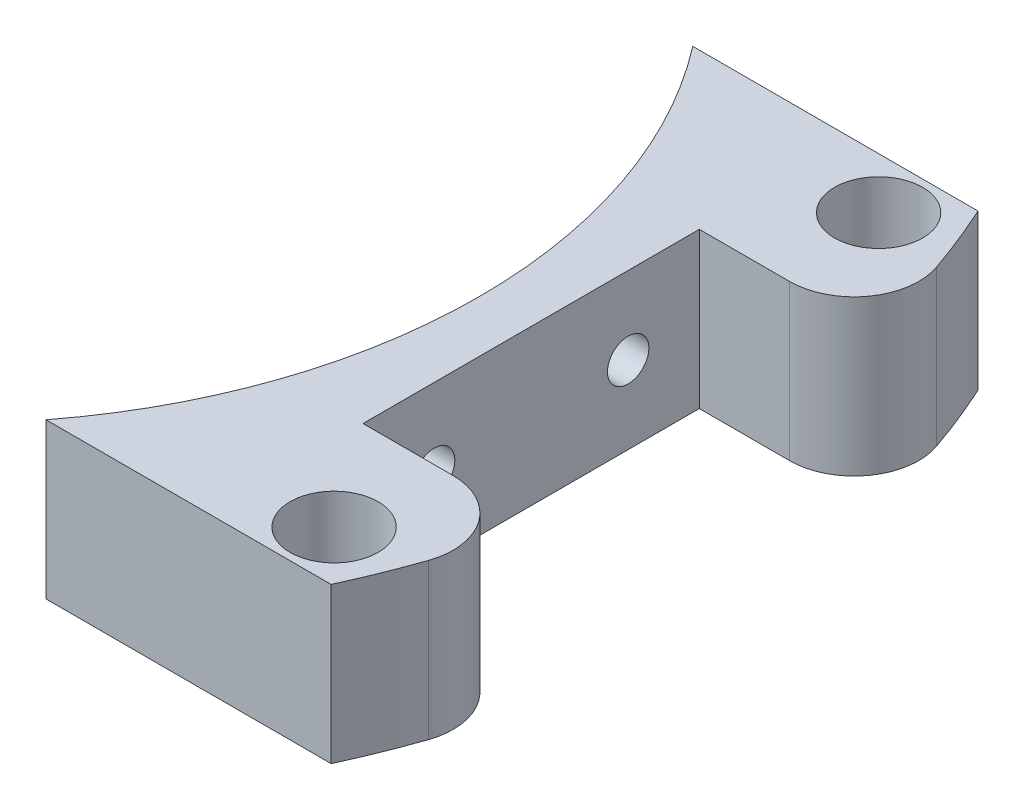
ISO-10303-21;
HEADER;
FILE_DESCRIPTION(('STEP AP214'),'2;1');
FILE_NAME('part.step','',(''),(''),'','','');
FILE_SCHEMA(('AUTOMOTIVE_DESIGN { 1 0 10303 214 1 1 1 1 }'));
ENDSEC;
DATA;
#1=APPLICATION_CONTEXT('core data for automotive mechanical design processes');
#2=APPLICATION_PROTOCOL_DEFINITION('international standard','automotive_design',2000,#1);
#3=PRODUCT_CONTEXT('',#1,'mechanical');
#4=PRODUCT('Part','Part','',(#3));
#5=PRODUCT_RELATED_PRODUCT_CATEGORY('part','',(#4));
#6=PRODUCT_DEFINITION_FORMATION('','',#4);
#7=PRODUCT_DEFINITION_CONTEXT('part definition',#1,'design');
#8=PRODUCT_DEFINITION('design','',#6,#7);
#9=PRODUCT_DEFINITION_SHAPE('','',#8);
#10=(LENGTH_UNIT() NAMED_UNIT(*) SI_UNIT(.MILLI.,.METRE.));
#11=(NAMED_UNIT(*) PLANE_ANGLE_UNIT() SI_UNIT($,.RADIAN.));
#12=(NAMED_UNIT(*) SI_UNIT($,.STERADIAN.) SOLID_ANGLE_UNIT());
#13=UNCERTAINTY_MEASURE_WITH_UNIT(LENGTH_MEASURE(1.E-05),#10,'distance_accuracy_value','');
#14=(GEOMETRIC_REPRESENTATION_CONTEXT(3) GLOBAL_UNCERTAINTY_ASSIGNED_CONTEXT((#13)) GLOBAL_UNIT_ASSIGNED_CONTEXT((#10,
#11,#12)) REPRESENTATION_CONTEXT('',''));
#15=CARTESIAN_POINT('',(0.,0.,0.));
#16=DIRECTION('',(0.,0.,1.));
#17=DIRECTION('',(1.,0.,0.));
#18=AXIS2_PLACEMENT_3D('',#15,#16,#17);
#19=CARTESIAN_POINT('',(-7.95357838980362,6.,-68.2096969177125));
#20=DIRECTION('',(1.,0.,0.));
#21=DIRECTION('',(0.,0.,-1.));
#22=AXIS2_PLACEMENT_3D('',#19,#20,#21);
#23=CYLINDRICAL_SURFACE('',#22,1.60000000000001);
#24=CARTESIAN_POINT('',(4.55026799165255,6.,-68.2096969177125));
#25=DIRECTION('',(1.,0.,0.));
#26=DIRECTION('',(0.,0.,-1.));
#27=AXIS2_PLACEMENT_3D('',#24,#25,#26);
#28=CIRCLE('',#27,1.60000000000001);
#29=CARTESIAN_POINT('',(4.55026799165255,6.,-69.8096969177125));
#30=VERTEX_POINT('',#29);
#31=EDGE_CURVE('E495',#30,#30,#28,.T.);
#32=CARTESIAN_POINT('',(2.04642161019638,6.,-68.2096969177125));
#33=DIRECTION('',(-1.,0.,0.));
#34=DIRECTION('',(0.,0.,1.));
#35=AXIS2_PLACEMENT_3D('',#32,#33,#34);
#36=CIRCLE('',#35,1.60000000000001);
#37=CARTESIAN_POINT('',(2.04642161019638,6.,-69.8096969177125));
#38=VERTEX_POINT('',#37);
#39=EDGE_CURVE('E486',#38,#38,#36,.T.);
#40=CARTESIAN_POINT('',(4.55026799165255,6.,-69.8096969177125));
#41=CARTESIAN_POINT('',(4.52418625851238,6.,-69.8096969177125));
#42=CARTESIAN_POINT('',(4.49810452537221,6.,-69.8096969177125));
#43=CARTESIAN_POINT('',(4.44594105909187,6.,-69.8096969177125));
#44=CARTESIAN_POINT('',(4.4198593259517,6.,-69.8096969177125));
#45=CARTESIAN_POINT('',(4.36769585967137,6.,-69.8096969177125));
#46=CARTESIAN_POINT('',(4.3416141265312,6.,-69.8096969177125));
#47=CARTESIAN_POINT('',(4.28945066025086,6.,-69.8096969177125));
#48=CARTESIAN_POINT('',(4.26336892711069,6.,-69.8096969177125));
#49=CARTESIAN_POINT('',(4.21120546083036,6.,-69.8096969177125));
#50=CARTESIAN_POINT('',(4.18512372769019,6.,-69.8096969177125));
#51=CARTESIAN_POINT('',(4.13296026140985,6.,-69.8096969177125));
#52=CARTESIAN_POINT('',(4.10687852826968,6.,-69.8096969177125));
#53=CARTESIAN_POINT('',(4.05471506198935,6.,-69.8096969177125));
#54=CARTESIAN_POINT('',(4.02863332884918,6.,-69.8096969177125));
#55=CARTESIAN_POINT('',(3.97646986256884,6.,-69.8096969177125));
#56=CARTESIAN_POINT('',(3.95038812942867,6.,-69.8096969177125));
#57=CARTESIAN_POINT('',(3.89822466314834,6.,-69.8096969177125));
#58=CARTESIAN_POINT('',(3.87214293000817,6.,-69.8096969177125));
#59=CARTESIAN_POINT('',(3.81997946372783,6.,-69.8096969177125));
#60=CARTESIAN_POINT('',(3.79389773058766,6.,-69.8096969177125));
#61=CARTESIAN_POINT('',(3.74173426430732,6.,-69.8096969177125));
#62=CARTESIAN_POINT('',(3.71565253116716,6.,-69.8096969177125));
#63=CARTESIAN_POINT('',(3.66348906488682,6.,-69.8096969177125));
#64=CARTESIAN_POINT('',(3.63740733174665,6.,-69.8096969177125));
#65=CARTESIAN_POINT('',(3.58524386546632,6.,-69.8096969177125));
#66=CARTESIAN_POINT('',(3.55916213232615,6.,-69.8096969177125));
#67=CARTESIAN_POINT('',(3.50699866604581,6.,-69.8096969177125));
#68=CARTESIAN_POINT('',(3.48091693290564,6.,-69.8096969177125));
#69=CARTESIAN_POINT('',(3.4287534666253,6.,-69.8096969177125));
#70=CARTESIAN_POINT('',(3.40267173348514,6.,-69.8096969177125));
#71=CARTESIAN_POINT('',(3.3505082672048,6.,-69.8096969177125));
#72=CARTESIAN_POINT('',(3.32442653406463,6.,-69.8096969177125));
#73=CARTESIAN_POINT('',(3.27226306778429,6.,-69.8096969177125));
#74=CARTESIAN_POINT('',(3.24618133464413,6.,-69.8096969177125));
#75=CARTESIAN_POINT('',(3.19401786836379,6.,-69.8096969177125));
#76=CARTESIAN_POINT('',(3.16793613522362,6.,-69.8096969177125));
#77=CARTESIAN_POINT('',(3.11577266894328,6.,-69.8096969177125));
#78=CARTESIAN_POINT('',(3.08969093580311,6.,-69.8096969177125));
#79=CARTESIAN_POINT('',(3.03752746952278,6.,-69.8096969177125));
#80=CARTESIAN_POINT('',(3.01144573638261,6.,-69.8096969177125));
#81=CARTESIAN_POINT('',(2.95928227010227,6.,-69.8096969177125));
#82=CARTESIAN_POINT('',(2.9332005369621,6.,-69.8096969177125));
#83=CARTESIAN_POINT('',(2.88103707068177,6.,-69.8096969177125));
#84=CARTESIAN_POINT('',(2.8549553375416,6.,-69.8096969177125));
#85=CARTESIAN_POINT('',(2.80279187126126,6.,-69.8096969177125));
#86=CARTESIAN_POINT('',(2.77671013812109,6.,-69.8096969177125));
#87=CARTESIAN_POINT('',(2.72454667184076,6.,-69.8096969177125));
#88=CARTESIAN_POINT('',(2.69846493870059,6.,-69.8096969177125));
#89=CARTESIAN_POINT('',(2.64630147242025,6.,-69.8096969177125));
#90=CARTESIAN_POINT('',(2.62021973928008,6.,-69.8096969177125));
#91=CARTESIAN_POINT('',(2.56805627299975,6.,-69.8096969177125));
#92=CARTESIAN_POINT('',(2.54197453985958,6.,-69.8096969177125));
#93=CARTESIAN_POINT('',(2.48981107357924,6.,-69.8096969177125));
#94=CARTESIAN_POINT('',(2.46372934043907,6.,-69.8096969177125));
#95=CARTESIAN_POINT('',(2.41156587415874,6.,-69.8096969177125));
#96=CARTESIAN_POINT('',(2.38548414101857,6.,-69.8096969177125));
#97=CARTESIAN_POINT('',(2.33332067473823,6.,-69.8096969177125));
#98=CARTESIAN_POINT('',(2.30723894159806,6.,-69.8096969177125));
#99=CARTESIAN_POINT('',(2.25507547531773,6.,-69.8096969177125));
#100=CARTESIAN_POINT('',(2.22899374217756,6.,-69.8096969177125));
#101=CARTESIAN_POINT('',(2.17683027589722,6.,-69.8096969177125));
#102=CARTESIAN_POINT('',(2.15074854275705,6.,-69.8096969177125));
#103=CARTESIAN_POINT('',(2.09858507647671,6.,-69.8096969177125));
#104=CARTESIAN_POINT('',(2.07250334333655,6.,-69.8096969177125));
#105=CARTESIAN_POINT('',(2.04642161019638,6.,-69.8096969177125));
#106=B_SPLINE_CURVE_WITH_KNOTS('',3,(#40,#41,#42,#43,#44,#45,#46,#47,#48,#49,#50,#51,#52,#53,
#54,#55,#56,#57,#58,#59,#60,#61,#62,#63,#64,#65,#66,#67,#68,#69,#70,#71,#72,#73,#74,#75,#76,#77,
#78,#79,#80,#81,#82,#83,#84,#85,#86,#87,#88,#89,#90,#91,#92,#93,#94,#95,#96,#97,#98,#99,#100,
#101,#102,#103,#104,#105),.UNSPECIFIED.,.F.,.F.,(4,2,2,2,2,2,2,2,2,2,2,2,2,2,2,2,2,2,2,2,2,2,2,
2,2,2,2,2,2,2,2,2,4),(0.,0.0782451994205055,0.156490398841011,0.234735598261517,
0.312980797682022,0.391225997102526,0.469471196523031,0.547716395943537,0.625961595364042,
0.704206794784548,0.782451994205053,0.860697193625559,0.938942393046063,1.01718759246657,
1.09543279188707,1.17367799130758,1.25192319072808,1.33016839014859,1.4084135895691,
1.4866587889896,1.56490398841011,1.64314918783061,1.72139438725112,1.79963958667162,
1.87788478609213,1.95612998551263,2.03437518493314,2.11262038435364,2.19086558377415,
2.26911078319465,2.34735598261516,2.42560118203566,2.50384638145617),.UNSPECIFIED.);
#107=EDGE_CURVE('BSEAM43',#30,#38,#106,.T.);
#108=ORIENTED_EDGE('',*,*,#31,.T.);
#109=ORIENTED_EDGE('',*,*,#39,.T.);
#110=ORIENTED_EDGE('',*,*,#107,.T.);
#111=ORIENTED_EDGE('',*,*,#107,.F.);
#112=EDGE_LOOP('',(#108,#110,#109,#111));
#113=FACE_BOUND('',#112,.T.);
#114=ADVANCED_FACE('F43',(#113),#23,.F.);
#115=CARTESIAN_POINT('',(-7.95357838980362,6.,-83.2096969177125));
#116=DIRECTION('',(1.,0.,0.));
#117=DIRECTION('',(0.,0.,-1.));
#118=AXIS2_PLACEMENT_3D('',#115,#116,#117);
#119=CYLINDRICAL_SURFACE('',#118,1.60000000000001);
#120=CARTESIAN_POINT('',(4.55026799165255,6.,-83.2096969177125));
#121=DIRECTION('',(1.,0.,0.));
#122=DIRECTION('',(0.,0.,-1.));
#123=AXIS2_PLACEMENT_3D('',#120,#121,#122);
#124=CIRCLE('',#123,1.60000000000001);
#125=CARTESIAN_POINT('',(4.55026799165255,6.,-84.8096969177125));
#126=VERTEX_POINT('',#125);
#127=EDGE_CURVE('E152',#126,#126,#124,.T.);
#128=CARTESIAN_POINT('',(2.04642161019638,6.,-83.2096969177125));
#129=DIRECTION('',(-1.,0.,0.));
#130=DIRECTION('',(0.,0.,1.));
#131=AXIS2_PLACEMENT_3D('',#128,#129,#130);
#132=CIRCLE('',#131,1.60000000000001);
#133=CARTESIAN_POINT('',(2.04642161019638,6.,-84.8096969177125));
#134=VERTEX_POINT('',#133);
#135=EDGE_CURVE('E481',#134,#134,#132,.T.);
#136=CARTESIAN_POINT('',(4.55026799165255,6.,-84.8096969177125));
#137=CARTESIAN_POINT('',(4.52418625851238,6.,-84.8096969177125));
#138=CARTESIAN_POINT('',(4.49810452537221,6.,-84.8096969177125));
#139=CARTESIAN_POINT('',(4.44594105909187,6.,-84.8096969177125));
#140=CARTESIAN_POINT('',(4.4198593259517,6.,-84.8096969177125));
#141=CARTESIAN_POINT('',(4.36769585967137,6.,-84.8096969177125));
#142=CARTESIAN_POINT('',(4.3416141265312,6.,-84.8096969177125));
#143=CARTESIAN_POINT('',(4.28945066025086,6.,-84.8096969177125));
#144=CARTESIAN_POINT('',(4.26336892711069,6.,-84.8096969177125));
#145=CARTESIAN_POINT('',(4.21120546083036,6.,-84.8096969177125));
#146=CARTESIAN_POINT('',(4.18512372769019,6.,-84.8096969177125));
#147=CARTESIAN_POINT('',(4.13296026140985,6.,-84.8096969177125));
#148=CARTESIAN_POINT('',(4.10687852826968,6.,-84.8096969177125));
#149=CARTESIAN_POINT('',(4.05471506198935,6.,-84.8096969177125));
#150=CARTESIAN_POINT('',(4.02863332884918,6.,-84.8096969177125));
#151=CARTESIAN_POINT('',(3.97646986256884,6.,-84.8096969177125));
#152=CARTESIAN_POINT('',(3.95038812942867,6.,-84.8096969177125));
#153=CARTESIAN_POINT('',(3.89822466314834,6.,-84.8096969177125));
#154=CARTESIAN_POINT('',(3.87214293000817,6.,-84.8096969177125));
#155=CARTESIAN_POINT('',(3.81997946372783,6.,-84.8096969177125));
#156=CARTESIAN_POINT('',(3.79389773058766,6.,-84.8096969177125));
#157=CARTESIAN_POINT('',(3.74173426430732,6.,-84.8096969177125));
#158=CARTESIAN_POINT('',(3.71565253116716,6.,-84.8096969177125));
#159=CARTESIAN_POINT('',(3.66348906488682,6.,-84.8096969177125));
#160=CARTESIAN_POINT('',(3.63740733174665,6.,-84.8096969177125));
#161=CARTESIAN_POINT('',(3.58524386546632,6.,-84.8096969177125));
#162=CARTESIAN_POINT('',(3.55916213232615,6.,-84.8096969177125));
#163=CARTESIAN_POINT('',(3.50699866604581,6.,-84.8096969177125));
#164=CARTESIAN_POINT('',(3.48091693290564,6.,-84.8096969177125));
#165=CARTESIAN_POINT('',(3.4287534666253,6.,-84.8096969177125));
#166=CARTESIAN_POINT('',(3.40267173348514,6.,-84.8096969177125));
#167=CARTESIAN_POINT('',(3.3505082672048,6.,-84.8096969177125));
#168=CARTESIAN_POINT('',(3.32442653406463,6.,-84.8096969177125));
#169=CARTESIAN_POINT('',(3.27226306778429,6.,-84.8096969177125));
#170=CARTESIAN_POINT('',(3.24618133464413,6.,-84.8096969177125));
#171=CARTESIAN_POINT('',(3.19401786836379,6.,-84.8096969177125));
#172=CARTESIAN_POINT('',(3.16793613522362,6.,-84.8096969177125));
#173=CARTESIAN_POINT('',(3.11577266894328,6.,-84.8096969177125));
#174=CARTESIAN_POINT('',(3.08969093580311,6.,-84.8096969177125));
#175=CARTESIAN_POINT('',(3.03752746952278,6.,-84.8096969177125));
#176=CARTESIAN_POINT('',(3.01144573638261,6.,-84.8096969177125));
#177=CARTESIAN_POINT('',(2.95928227010227,6.,-84.8096969177125));
#178=CARTESIAN_POINT('',(2.9332005369621,6.,-84.8096969177125));
#179=CARTESIAN_POINT('',(2.88103707068177,6.,-84.8096969177125));
#180=CARTESIAN_POINT('',(2.8549553375416,6.,-84.8096969177125));
#181=CARTESIAN_POINT('',(2.80279187126126,6.,-84.8096969177125));
#182=CARTESIAN_POINT('',(2.77671013812109,6.,-84.8096969177125));
#183=CARTESIAN_POINT('',(2.72454667184076,6.,-84.8096969177125));
#184=CARTESIAN_POINT('',(2.69846493870059,6.,-84.8096969177125));
#185=CARTESIAN_POINT('',(2.64630147242025,6.,-84.8096969177125));
#186=CARTESIAN_POINT('',(2.62021973928008,6.,-84.8096969177125));
#187=CARTESIAN_POINT('',(2.56805627299975,6.,-84.8096969177125));
#188=CARTESIAN_POINT('',(2.54197453985958,6.,-84.8096969177125));
#189=CARTESIAN_POINT('',(2.48981107357924,6.,-84.8096969177125));
#190=CARTESIAN_POINT('',(2.46372934043907,6.,-84.8096969177125));
#191=CARTESIAN_POINT('',(2.41156587415874,6.,-84.8096969177125));
#192=CARTESIAN_POINT('',(2.38548414101857,6.,-84.8096969177125));
#193=CARTESIAN_POINT('',(2.33332067473823,6.,-84.8096969177125));
#194=CARTESIAN_POINT('',(2.30723894159806,6.,-84.8096969177125));
#195=CARTESIAN_POINT('',(2.25507547531773,6.,-84.8096969177125));
#196=CARTESIAN_POINT('',(2.22899374217756,6.,-84.8096969177125));
#197=CARTESIAN_POINT('',(2.17683027589722,6.,-84.8096969177125));
#198=CARTESIAN_POINT('',(2.15074854275705,6.,-84.8096969177125));
#199=CARTESIAN_POINT('',(2.09858507647671,6.,-84.8096969177125));
#200=CARTESIAN_POINT('',(2.07250334333655,6.,-84.8096969177125));
#201=CARTESIAN_POINT('',(2.04642161019638,6.,-84.8096969177125));
#202=B_SPLINE_CURVE_WITH_KNOTS('',3,(#136,#137,#138,#139,#140,#141,#142,#143,#144,#145,#146,
#147,#148,#149,#150,#151,#152,#153,#154,#155,#156,#157,#158,#159,#160,#161,#162,#163,#164,#165,
#166,#167,#168,#169,#170,#171,#172,#173,#174,#175,#176,#177,#178,#179,#180,#181,#182,#183,#184,
#185,#186,#187,#188,#189,#190,#191,#192,#193,#194,#195,#196,#197,#198,#199,#200,#201),
.UNSPECIFIED.,.F.,.F.,(4,2,2,2,2,2,2,2,2,2,2,2,2,2,2,2,2,2,2,2,2,2,2,2,2,2,2,2,2,2,2,2,4),(0.,
0.0782451994205055,0.156490398841011,0.234735598261517,0.312980797682022,0.391225997102526,
0.469471196523031,0.547716395943537,0.625961595364042,0.704206794784548,0.782451994205053,
0.860697193625559,0.938942393046063,1.01718759246657,1.09543279188707,1.17367799130758,
1.25192319072808,1.33016839014859,1.4084135895691,1.4866587889896,1.56490398841011,
1.64314918783061,1.72139438725112,1.79963958667162,1.87788478609213,1.95612998551263,
2.03437518493314,2.11262038435364,2.19086558377415,2.26911078319465,2.34735598261516,
2.42560118203566,2.50384638145617),.UNSPECIFIED.);
#203=EDGE_CURVE('BSEAM237',#126,#134,#202,.T.);
#204=ORIENTED_EDGE('',*,*,#127,.T.);
#205=ORIENTED_EDGE('',*,*,#135,.T.);
#206=ORIENTED_EDGE('',*,*,#203,.T.);
#207=ORIENTED_EDGE('',*,*,#203,.F.);
#208=EDGE_LOOP('',(#204,#206,#205,#207));
#209=FACE_BOUND('',#208,.T.);
#210=ADVANCED_FACE('F237',(#209),#119,.F.);
#211=CARTESIAN_POINT('',(-40.4497320083475,12.,-75.7096969177125));
#212=DIRECTION('',(0.,-1.,0.));
#213=DIRECTION('',(0.,0.,-1.));
#214=AXIS2_PLACEMENT_3D('',#211,#212,#213);
#215=CYLINDRICAL_SURFACE('',#214,60.);
#216=CARTESIAN_POINT('',(-40.4497320083475,0.,-75.7096969177125));
#217=DIRECTION('',(0.,1.,0.));
#218=DIRECTION('',(0.,0.,1.));
#219=AXIS2_PLACEMENT_3D('',#216,#217,#218);
#220=CIRCLE('',#219,60.);
#221=CARTESIAN_POINT('',(14.0938285648311,0.,-50.7096969177125));
#222=VERTEX_POINT('',#221);
#223=CARTESIAN_POINT('',(16.2460634542836,0.,-56.0733332813489));
#224=VERTEX_POINT('',#223);
#225=EDGE_CURVE('E184',#222,#224,#220,.T.);
#226=ORIENTED_EDGE('',*,*,#225,.T.);
#227=DIRECTION('',(0.,-1.,0.));
#228=VECTOR('',#227,1.);
#229=CARTESIAN_POINT('',(16.2460634542836,12.,-56.0733332813489));
#230=LINE('',#229,#228);
#231=CARTESIAN_POINT('',(16.2460634542836,12.,-56.0733332813489));
#232=VERTEX_POINT('',#231);
#233=EDGE_CURVE('E51',#224,#232,#230,.F.);
#234=ORIENTED_EDGE('',*,*,#233,.T.);
#235=CARTESIAN_POINT('',(-40.4497320083475,12.,-75.7096969177125));
#236=DIRECTION('',(0.,1.,0.));
#237=DIRECTION('',(0.,0.,1.));
#238=AXIS2_PLACEMENT_3D('',#235,#236,#237);
#239=CIRCLE('',#238,60.);
#240=CARTESIAN_POINT('',(14.0938285648311,12.,-50.7096969177125));
#241=VERTEX_POINT('',#240);
#242=EDGE_CURVE('E165',#241,#232,#239,.T.);
#243=ORIENTED_EDGE('',*,*,#242,.F.);
#244=DIRECTION('',(0.,-1.,0.));
#245=VECTOR('',#244,1.);
#246=CARTESIAN_POINT('',(14.0938285648311,12.,-50.7096969177125));
#247=LINE('',#246,#245);
#248=EDGE_CURVE('E200',#241,#222,#247,.T.);
#249=ORIENTED_EDGE('',*,*,#248,.T.);
#250=EDGE_LOOP('',(#226,#234,#243,#249));
#251=FACE_BOUND('',#250,.T.);
#252=ADVANCED_FACE('F240',(#251),#215,.T.);
#253=CARTESIAN_POINT('',(0.,12.,-50.7096969177125));
#254=DIRECTION('',(0.,0.,-1.));
#255=DIRECTION('',(-1.,0.,0.));
#256=AXIS2_PLACEMENT_3D('',#253,#254,#255);
#257=PLANE('',#256);
#258=DIRECTION('',(1.,0.,0.));
#259=VECTOR('',#258,1.);
#260=CARTESIAN_POINT('',(0.,0.,-50.7096969177125));
#261=LINE('',#260,#259);
#262=CARTESIAN_POINT('',(-7.95357838980362,0.,-50.7096969177125));
#263=VERTEX_POINT('',#262);
#264=EDGE_CURVE('E180',#263,#222,#261,.T.);
#265=ORIENTED_EDGE('',*,*,#264,.T.);
#266=ORIENTED_EDGE('',*,*,#248,.F.);
#267=DIRECTION('',(1.,0.,0.));
#268=VECTOR('',#267,1.);
#269=CARTESIAN_POINT('',(0.,12.,-50.7096969177125));
#270=LINE('',#269,#268);
#271=CARTESIAN_POINT('',(-7.95357838980362,12.,-50.7096969177125));
#272=VERTEX_POINT('',#271);
#273=EDGE_CURVE('E160',#272,#241,#270,.T.);
#274=ORIENTED_EDGE('',*,*,#273,.F.);
#275=DIRECTION('',(0.,-1.,0.));
#276=VECTOR('',#275,1.);
#277=CARTESIAN_POINT('',(-7.95357838980362,12.,-50.7096969177125));
#278=LINE('',#277,#276);
#279=EDGE_CURVE('E177',#272,#263,#278,.T.);
#280=ORIENTED_EDGE('',*,*,#279,.T.);
#281=EDGE_LOOP('',(#265,#266,#274,#280));
#282=FACE_BOUND('',#281,.T.);
#283=ADVANCED_FACE('F279',(#282),#257,.F.);
#284=CARTESIAN_POINT('',(16.2460634542836,12.,-95.3460605540761));
#285=VERTEX_POINT('',#284);
#286=CARTESIAN_POINT('',(14.0938285648311,12.,-100.709696917713));
#287=VERTEX_POINT('',#286);
#288=EDGE_CURVE('E164',#285,#287,#239,.T.);
#289=ORIENTED_EDGE('',*,*,#288,.F.);
#290=DIRECTION('',(0.,-1.,0.));
#291=VECTOR('',#290,1.);
#292=CARTESIAN_POINT('',(16.2460634542836,12.,-95.3460605540761));
#293=LINE('',#292,#291);
#294=CARTESIAN_POINT('',(16.2460634542836,0.,-95.3460605540761));
#295=VERTEX_POINT('',#294);
#296=EDGE_CURVE('E288',#285,#295,#293,.T.);
#297=ORIENTED_EDGE('',*,*,#296,.T.);
#298=CARTESIAN_POINT('',(14.0938285648311,0.,-100.709696917713));
#299=VERTEX_POINT('',#298);
#300=EDGE_CURVE('E183',#295,#299,#220,.T.);
#301=ORIENTED_EDGE('',*,*,#300,.T.);
#302=DIRECTION('',(0.,-1.,0.));
#303=VECTOR('',#302,1.);
#304=CARTESIAN_POINT('',(14.0938285648311,12.,-100.709696917713));
#305=LINE('',#304,#303);
#306=EDGE_CURVE('E197',#287,#299,#305,.T.);
#307=ORIENTED_EDGE('',*,*,#306,.F.);
#308=EDGE_LOOP('',(#289,#297,#301,#307));
#309=FACE_BOUND('',#308,.T.);
#310=ADVANCED_FACE('F313',(#309),#215,.T.);
#311=CARTESIAN_POINT('',(0.,12.,-100.709696917713));
#312=DIRECTION('',(0.,0.,-1.));
#313=DIRECTION('',(-1.,0.,0.));
#314=AXIS2_PLACEMENT_3D('',#311,#312,#313);
#315=PLANE('',#314);
#316=DIRECTION('',(1.,0.,0.));
#317=VECTOR('',#316,1.);
#318=CARTESIAN_POINT('',(0.,0.,-100.709696917713));
#319=LINE('',#318,#317);
#320=CARTESIAN_POINT('',(-7.95357838980362,0.,-100.709696917713));
#321=VERTEX_POINT('',#320);
#322=EDGE_CURVE('E186',#321,#299,#319,.T.);
#323=ORIENTED_EDGE('',*,*,#322,.F.);
#324=DIRECTION('',(0.,-1.,0.));
#325=VECTOR('',#324,1.);
#326=CARTESIAN_POINT('',(-7.95357838980362,12.,-100.709696917713));
#327=LINE('',#326,#325);
#328=CARTESIAN_POINT('',(-7.95357838980362,12.,-100.709696917713));
#329=VERTEX_POINT('',#328);
#330=EDGE_CURVE('E195',#329,#321,#327,.T.);
#331=ORIENTED_EDGE('',*,*,#330,.F.);
#332=DIRECTION('',(1.,0.,0.));
#333=VECTOR('',#332,1.);
#334=CARTESIAN_POINT('',(0.,12.,-100.709696917713));
#335=LINE('',#334,#333);
#336=EDGE_CURVE('E168',#329,#287,#335,.T.);
#337=ORIENTED_EDGE('',*,*,#336,.T.);
#338=ORIENTED_EDGE('',*,*,#306,.T.);
#339=EDGE_LOOP('',(#323,#331,#337,#338));
#340=FACE_BOUND('',#339,.T.);
#341=ADVANCED_FACE('F275',(#340),#315,.T.);
#342=CARTESIAN_POINT('',(-40.4497320083475,12.,-75.7096969177125));
#343=DIRECTION('',(0.,-1.,0.));
#344=DIRECTION('',(0.,0.,-1.));
#345=AXIS2_PLACEMENT_3D('',#342,#343,#344);
#346=CYLINDRICAL_SURFACE('',#345,41.);
#347=CARTESIAN_POINT('',(0.354679517858884,6.,-79.7096969177125));
#348=CARTESIAN_POINT('',(0.354679923211772,6.19573040612567,-79.7097054268311));
#349=CARTESIAN_POINT('',(0.353074982542199,6.39159377568724,-79.7261709847604));
#350=CARTESIAN_POINT('',(0.34657937462129,6.77791269743719,-79.791610376265));
#351=CARTESIAN_POINT('',(0.341685000840673,6.96836189634504,-79.8406208807005));
#352=CARTESIAN_POINT('',(0.328405270445636,7.33821089703764,-79.9697093316831));
#353=CARTESIAN_POINT('',(0.320021564498353,7.51761587740801,-80.0497725871648));
#354=CARTESIAN_POINT('',(0.299477338153755,7.8603287133971,-80.2385943896633));
#355=CARTESIAN_POINT('',(0.287317720526969,8.0236404044266,-80.3473460767214));
#356=CARTESIAN_POINT('',(0.258906467776437,8.32975178565088,-80.5904443017862));
#357=CARTESIAN_POINT('',(0.242651641950646,8.47253534487044,-80.7248107771027));
#358=CARTESIAN_POINT('',(0.205818889250409,8.73348555673605,-81.0151230069587));
#359=CARTESIAN_POINT('',(0.185240786069454,8.85165120505359,-81.1710696414648));
#360=CARTESIAN_POINT('',(0.139589463976859,9.06059601934668,-81.5006137811279));
#361=CARTESIAN_POINT('',(0.114498933887219,9.15126597183206,-81.6742781061345));
#362=CARTESIAN_POINT('',(0.0600212948696441,9.30227376552961,-82.033690853151));
#363=CARTESIAN_POINT('',(0.0306340062558991,9.36261033776393,-82.2194397803455));
#364=CARTESIAN_POINT('',(-0.0323391960213345,9.4520153060868,-82.5996786834472));
#365=CARTESIAN_POINT('',(-0.0659649174260189,9.48075813518512,-82.7942385466744));
#366=CARTESIAN_POINT('',(-0.136439409792408,9.50538004263757,-83.1848447591623));
#367=CARTESIAN_POINT('',(-0.173288469900953,9.50125616971619,-83.3808912403352));
#368=CARTESIAN_POINT('',(-0.249789214873089,9.46018073218589,-83.7722641610184));
#369=CARTESIAN_POINT('',(-0.289476412987609,9.42270287025929,-83.9675284398274));
#370=CARTESIAN_POINT('',(-0.3697557724013,9.31538099702638,-84.3487643911925));
#371=CARTESIAN_POINT('',(-0.41034802665441,9.24553364649492,-84.5347351028343));
#372=CARTESIAN_POINT('',(-0.491364142438815,9.07427428710916,-84.8946477798246));
#373=CARTESIAN_POINT('',(-0.531779132666824,8.97246808877021,-85.0684044017748));
#374=CARTESIAN_POINT('',(-0.61007771995571,8.74027296987562,-85.3963064294897));
#375=CARTESIAN_POINT('',(-0.647961278371352,8.60988361309503,-85.5504515358944));
#376=CARTESIAN_POINT('',(-0.719116277065589,8.32460764301623,-85.8338991942233));
#377=CARTESIAN_POINT('',(-0.752408484695859,8.16983860750094,-85.9633147011948));
#378=CARTESIAN_POINT('',(-0.812733747526876,7.83954419022112,-86.1940970487541));
#379=CARTESIAN_POINT('',(-0.839767816270477,7.66402217649123,-86.2954684317741));
#380=CARTESIAN_POINT('',(-0.885305949781518,7.3021856244904,-86.4644017786097));
#381=CARTESIAN_POINT('',(-0.904019620590787,7.11628758868092,-86.5327987045176));
#382=CARTESIAN_POINT('',(-0.932782209567152,6.73500232541535,-86.6373525449817));
#383=CARTESIAN_POINT('',(-0.942833044573983,6.53961720729398,-86.6735165918196));
#384=CARTESIAN_POINT('',(-0.953441883237553,6.15157756913561,-86.7116714329496));
#385=CARTESIAN_POINT('',(-0.954291407755815,5.95903359222422,-86.7147116916077));
#386=CARTESIAN_POINT('',(-0.947202190863957,5.57622149685476,-86.6892374030224));
#387=CARTESIAN_POINT('',(-0.939264164419688,5.38595319451807,-86.6607254229076));
#388=CARTESIAN_POINT('',(-0.915223062400901,5.01511442392416,-86.5736092826824));
#389=CARTESIAN_POINT('',(-0.899206424474365,4.8344632222848,-86.5153236057215));
#390=CARTESIAN_POINT('',(-0.859990479038477,4.4855892520547,-86.3707448976627));
#391=CARTESIAN_POINT('',(-0.836790587853995,4.31736749479458,-86.2844495906154));
#392=CARTESIAN_POINT('',(-0.783971020487292,3.99456844201397,-86.0845825895897));
#393=CARTESIAN_POINT('',(-0.754237034552509,3.8403136885781,-85.9705207245178));
#394=CARTESIAN_POINT('',(-0.690164059239124,3.55296510411669,-85.7193683175621));
#395=CARTESIAN_POINT('',(-0.655824304830825,3.41987479660293,-85.582273948964));
#396=CARTESIAN_POINT('',(-0.5829868441672,3.17406706947198,-85.2839809675382));
#397=CARTESIAN_POINT('',(-0.54439004884987,3.06215577531294,-85.1221419800958));
#398=CARTESIAN_POINT('',(-0.465756726965528,2.86705827099465,-84.7822996179304));
#399=CARTESIAN_POINT('',(-0.425720006882688,2.78387593785496,-84.6042940655939));
#400=CARTESIAN_POINT('',(-0.344940330898147,2.64688174541276,-84.2327585243033));
#401=CARTESIAN_POINT('',(-0.304201428290655,2.59376290720614,-84.0389716208832));
#402=CARTESIAN_POINT('',(-0.224439229265524,2.52137768063248,-83.6448236045382));
#403=CARTESIAN_POINT('',(-0.185415964201244,2.50211191068138,-83.444462371584));
#404=CARTESIAN_POINT('',(-0.11033175080612,2.49821718938717,-83.0428084993085));
#405=CARTESIAN_POINT('',(-0.074271150767516,2.5135923044204,-82.8415157534081));
#406=CARTESIAN_POINT('',(-0.00605631096722571,2.57886522385815,-82.4439217322975));
#407=CARTESIAN_POINT('',(0.0260982290673591,2.62876037260656,-82.247620074323));
#408=CARTESIAN_POINT('',(0.0854648740642672,2.76093386349668,-81.8687612746825));
#409=CARTESIAN_POINT('',(0.112742837467254,2.84272409535248,-81.6860442026073));
#410=CARTESIAN_POINT('',(0.162673141575876,3.03656528168169,-81.3367481736201));
#411=CARTESIAN_POINT('',(0.185326041328885,3.14861257507265,-81.170167267555));
#412=CARTESIAN_POINT('',(0.225710676984874,3.39790468185967,-80.8606578726223));
#413=CARTESIAN_POINT('',(0.243512647380675,3.53473609449505,-80.7174054282746));
#414=CARTESIAN_POINT('',(0.274856014956067,3.83089924887446,-80.4557836621204));
#415=CARTESIAN_POINT('',(0.288396618363576,3.99023517457374,-80.3374189775604));
#416=CARTESIAN_POINT('',(0.311420774558335,4.32544108920337,-80.1300204925962));
#417=CARTESIAN_POINT('',(0.320935863792207,4.50116887323608,-80.0407600016816));
#418=CARTESIAN_POINT('',(0.336363112503396,4.8651003151523,-79.8929987716228));
#419=CARTESIAN_POINT('',(0.342279409271178,5.05328936998366,-79.834462721309));
#420=CARTESIAN_POINT('',(0.349255126696864,5.36881989841966,-79.7647377203937));
#421=CARTESIAN_POINT('',(0.351292288627219,5.49413842883607,-79.7441250461151));
#422=CARTESIAN_POINT('',(0.354004352194884,5.74628601464618,-79.7166018929898));
#423=CARTESIAN_POINT('',(0.354679255083293,5.8731150686525,-79.7096914015592));
#424=CARTESIAN_POINT('',(0.354679517858884,6.,-79.7096969177125));
#425=B_SPLINE_CURVE_WITH_KNOTS('',3,(#347,#348,#349,#350,#351,#352,#353,#354,#355,#356,#357,
#358,#359,#360,#361,#362,#363,#364,#365,#366,#367,#368,#369,#370,#371,#372,#373,#374,#375,#376,
#377,#378,#379,#380,#381,#382,#383,#384,#385,#386,#387,#388,#389,#390,#391,#392,#393,#394,#395,
#396,#397,#398,#399,#400,#401,#402,#403,#404,#405,#406,#407,#408,#409,#410,#411,#412,#413,#414,
#415,#416,#417,#418,#419,#420,#421,#422,#423,#424),.UNSPECIFIED.,.T.,.F.,(4,2,2,2,2,2,2,2,2,2,2,
2,2,2,2,2,2,2,2,2,2,2,2,2,2,2,2,2,2,2,2,2,2,2,2,2,2,2,4),(0.,0.586728798766341,1.17411983373797,
1.7612333121542,2.34820652744095,2.93563849353365,3.52309442019648,4.11285406003008,
4.70263837003395,5.29844490737565,5.89430494594947,6.49973719824874,7.10523192063531,
7.71850962981822,8.33179669925683,8.94221180190528,9.55252797492047,10.1464515622645,
10.7402436974094,11.3151658087991,11.8900411472631,12.4588920615264,13.027789209897,
13.6075682733325,14.1874437590653,14.7862336894042,15.3851043958626,15.997270050038,
16.609446886924,17.2216955889224,17.8338971953342,18.4370760094743,19.0401818720938,
19.63402546949,20.2279796177614,20.8171903850257,21.4057224896041,21.7860778630842,
22.1664328872457),.UNSPECIFIED.);
#426=CARTESIAN_POINT('',(0.354679517858884,6.,-79.7096969177125));
#427=VERTEX_POINT('',#426);
#428=EDGE_CURVE('E212',#427,#427,#425,.T.);
#429=ORIENTED_EDGE('',*,*,#428,.F.);
#430=EDGE_LOOP('',(#429));
#431=FACE_BOUND('',#430,.T.);
#432=CARTESIAN_POINT('',(-0.952896692084454,6.,-64.7096969177125));
#433=CARTESIAN_POINT('',(-0.952892877323954,6.19174493134551,-64.709706098088));
#434=CARTESIAN_POINT('',(-0.948480427385539,6.38362334396103,-64.7255161088227));
#435=CARTESIAN_POINT('',(-0.931089349392405,6.76196499823755,-64.7882548364049));
#436=CARTESIAN_POINT('',(-0.918100854716773,6.94842174407669,-64.8352193964216));
#437=CARTESIAN_POINT('',(-0.884369390380926,7.31027938827759,-64.958597536184));
#438=CARTESIAN_POINT('',(-0.863637212739306,7.48569527805766,-65.0349701358422));
#439=CARTESIAN_POINT('',(-0.815608516369856,7.82104994606107,-65.214704417535));
#440=CARTESIAN_POINT('',(-0.788312848324136,7.98099072622112,-65.3180626021656));
#441=CARTESIAN_POINT('',(-0.72803496888983,8.28428210067552,-65.550884379051));
#442=CARTESIAN_POINT('',(-0.694955585814661,8.42726469648194,-65.6808018027445));
#443=CARTESIAN_POINT('',(-0.625124534364025,8.68959179066991,-65.9617960672202));
#444=CARTESIAN_POINT('',(-0.588372187259541,8.80893190794863,-66.1128768208653));
#445=CARTESIAN_POINT('',(-0.511648246168633,9.02449705461684,-66.4372608556418));
#446=CARTESIAN_POINT('',(-0.471611425300114,9.1198656359826,-66.6111183244671));
#447=CARTESIAN_POINT('',(-0.391115048632684,9.27993609173149,-66.9723386555479));
#448=CARTESIAN_POINT('',(-0.350655447645279,9.34463465298974,-67.1597029743615));
#449=CARTESIAN_POINT('',(-0.270234909186399,9.44233442285725,-67.5459055494178));
#450=CARTESIAN_POINT('',(-0.230291756045584,9.47482237060262,-67.7448777074799));
#451=CARTESIAN_POINT('',(-0.152942111878385,9.50519246253705,-68.1459398045685));
#452=CARTESIAN_POINT('',(-0.115535559913192,9.50307543836514,-68.3480296685527));
#453=CARTESIAN_POINT('',(-0.0445371084067106,9.46411796111801,-68.7482818851168));
#454=CARTESIAN_POINT('',(-0.0109239250672953,9.42748326882382,-68.9464604115114));
#455=CARTESIAN_POINT('',(0.0520202991617965,9.32052363342582,-69.3342240646239));
#456=CARTESIAN_POINT('',(0.0813517154404146,9.25020164605497,-69.5238099436659));
#457=CARTESIAN_POINT('',(0.134907869636698,9.07907433413792,-69.8856133672601));
#458=CARTESIAN_POINT('',(0.159208077806901,8.97878476499893,-70.0580637105196));
#459=CARTESIAN_POINT('',(0.203214695518242,8.75005325226369,-70.3838187791185));
#460=CARTESIAN_POINT('',(0.222921449713401,8.62161342222945,-70.5371249404747));
#461=CARTESIAN_POINT('',(0.257650946481886,8.34211980152529,-70.8179916913402));
#462=CARTESIAN_POINT('',(0.272733090720486,8.19139319480788,-70.9458706520407));
#463=CARTESIAN_POINT('',(0.298840443406548,7.87035087161383,-71.1745963401853));
#464=CARTESIAN_POINT('',(0.309865799866561,7.70003587012054,-71.2754440538323));
#465=CARTESIAN_POINT('',(0.328116529015009,7.34582857218019,-71.4465453832875));
#466=CARTESIAN_POINT('',(0.335365543131456,7.16202917031883,-71.5169888535876));
#467=CARTESIAN_POINT('',(0.346438819625657,6.78513763733622,-71.6261347074586));
#468=CARTESIAN_POINT('',(0.350263122177214,6.59204561525065,-71.6648374633655));
#469=CARTESIAN_POINT('',(0.354649367506949,6.20242423109014,-71.7093257991549));
#470=CARTESIAN_POINT('',(0.355217180908741,6.00590169554369,-71.7151706131925));
#471=CARTESIAN_POINT('',(0.353132358885641,5.61466164184662,-71.6939319299737));
#472=CARTESIAN_POINT('',(0.350479736198977,5.41994411655946,-71.6668485629626));
#473=CARTESIAN_POINT('',(0.341836400945137,5.03789125643067,-71.58055583672));
#474=CARTESIAN_POINT('',(0.335846517642286,4.85055410004393,-71.5213544584777));
#475=CARTESIAN_POINT('',(0.320291979492544,4.48852372933732,-71.3725658617117));
#476=CARTESIAN_POINT('',(0.310727345117181,4.31383044261664,-71.2829788171978));
#477=CARTESIAN_POINT('',(0.287716426958221,3.98194650226781,-71.076005203195));
#478=CARTESIAN_POINT('',(0.274268379908773,3.82476384437882,-70.9586060099424));
#479=CARTESIAN_POINT('',(0.243201611323086,3.53239678474584,-70.6994940184517));
#480=CARTESIAN_POINT('',(0.2255828944598,3.39721235835462,-70.5577812474553));
#481=CARTESIAN_POINT('',(0.185929397235888,3.15224090942814,-70.2538262171192));
#482=CARTESIAN_POINT('',(0.16388350684121,3.04251931006429,-70.0915326955534));
#483=CARTESIAN_POINT('',(0.115386964042315,2.85182987063938,-69.7514598419901));
#484=CARTESIAN_POINT('',(0.0889361952305768,2.77086279064989,-69.5736801007982));
#485=CARTESIAN_POINT('',(0.03163311213544,2.63918069376274,-69.2063228567158));
#486=CARTESIAN_POINT('',(0.000748025091680226,2.5887069638407,-69.0166640343704));
#487=CARTESIAN_POINT('',(-0.0647441381410586,2.52011239035838,-68.6322131513435));
#488=CARTESIAN_POINT('',(-0.0993515086013054,2.50199410670751,-68.4374206857337));
#489=CARTESIAN_POINT('',(-0.171993895701008,2.49829107878431,-68.0452232645191));
#490=CARTESIAN_POINT('',(-0.210071612426338,2.51318564267347,-67.8478217310124));
#491=CARTESIAN_POINT('',(-0.288058197401686,2.57584773063519,-67.4586748552473));
#492=CARTESIAN_POINT('',(-0.327967260025727,2.62361875169162,-67.2669301169504));
#493=CARTESIAN_POINT('',(-0.408823475111472,2.75162438520012,-66.8913565247051));
#494=CARTESIAN_POINT('',(-0.44977712685636,2.83235116512946,-66.7076966389257));
#495=CARTESIAN_POINT('',(-0.530410650438807,3.02408480022466,-66.3566083821262));
#496=CARTESIAN_POINT('',(-0.570090490055914,3.13509242065605,-66.1891804214685));
#497=CARTESIAN_POINT('',(-0.646425819539753,3.38482404110941,-65.8749080668033));
#498=CARTESIAN_POINT('',(-0.683073332311403,3.5236180548439,-65.7281172959974));
#499=CARTESIAN_POINT('',(-0.751321649673205,3.8251243180143,-65.4600431780014));
#500=CARTESIAN_POINT('',(-0.782921752231462,3.98783988860712,-65.3387633783275));
#501=CARTESIAN_POINT('',(-0.838681296667506,4.32923715893395,-65.1278081313769));
#502=CARTESIAN_POINT('',(-0.862974867979302,4.50754185602583,-65.0375579593846));
#503=CARTESIAN_POINT('',(-0.903435003696634,4.87755450427769,-64.8885871342378));
#504=CARTESIAN_POINT('',(-0.919613254265845,5.0692427268943,-64.8298211351265));
#505=CARTESIAN_POINT('',(-0.938389708579252,5.38527186170718,-64.7618889260164));
#506=CARTESIAN_POINT('',(-0.943815513211363,5.50731392026006,-64.7423478110552));
#507=CARTESIAN_POINT('',(-0.951070190871786,5.75288552645361,-64.7162490052427));
#508=CARTESIAN_POINT('',(-0.952899150804107,5.87641503808312,-64.7096910007042));
#509=CARTESIAN_POINT('',(-0.952896692084454,6.,-64.7096969177125));
#510=B_SPLINE_CURVE_WITH_KNOTS('',3,(#432,#433,#434,#435,#436,#437,#438,#439,#440,#441,#442,
#443,#444,#445,#446,#447,#448,#449,#450,#451,#452,#453,#454,#455,#456,#457,#458,#459,#460,#461,
#462,#463,#464,#465,#466,#467,#468,#469,#470,#471,#472,#473,#474,#475,#476,#477,#478,#479,#480,
#481,#482,#483,#484,#485,#486,#487,#488,#489,#490,#491,#492,#493,#494,#495,#496,#497,#498,#499,
#500,#501,#502,#503,#504,#505,#506,#507,#508,#509),.UNSPECIFIED.,.T.,.F.,(4,2,2,2,2,2,2,2,2,2,2,
2,2,2,2,2,2,2,2,2,2,2,2,2,2,2,2,2,2,2,2,2,2,2,2,2,2,2,4),(0.,0.574774050912045,1.15021052633127,
1.72484801639279,2.29941106883505,2.8847650647619,3.4702274292849,4.07432097117048,
4.67847975531925,5.29211782950747,5.90574115654811,6.51572964575874,7.12566462420397,
7.72565406793036,8.32559847901049,8.91747844561788,9.50933681524845,10.0974439829545,
10.6855442517409,11.2725839909041,11.8596214080769,12.4465130193723,13.0334012697666,
13.6205564172495,14.2077109068678,14.7963577055182,15.3850200627799,15.9782813614116,
16.5715895958171,17.1735683203591,17.7756110857222,18.386994429333,18.9983932254192,
19.6113524119304,20.224396779331,20.8253827619249,21.4255008147552,21.7959676897243,
22.1664256136669),.UNSPECIFIED.);
#511=CARTESIAN_POINT('',(-0.952896692084454,6.,-64.7096969177125));
#512=VERTEX_POINT('',#511);
#513=EDGE_CURVE('E204',#512,#512,#510,.T.);
#514=ORIENTED_EDGE('',*,*,#513,.F.);
#515=EDGE_LOOP('',(#514));
#516=FACE_BOUND('',#515,.T.);
#517=CARTESIAN_POINT('',(-40.4497320083475,0.,-75.7096969177125));
#518=DIRECTION('',(0.,1.,0.));
#519=DIRECTION('',(0.,0.,1.));
#520=AXIS2_PLACEMENT_3D('',#517,#518,#519);
#521=CIRCLE('',#520,41.);
#522=EDGE_CURVE('E189',#263,#321,#521,.T.);
#523=ORIENTED_EDGE('',*,*,#522,.F.);
#524=ORIENTED_EDGE('',*,*,#279,.F.);
#525=CARTESIAN_POINT('',(-40.4497320083475,12.,-75.7096969177125));
#526=DIRECTION('',(0.,1.,0.));
#527=DIRECTION('',(0.,0.,1.));
#528=AXIS2_PLACEMENT_3D('',#525,#526,#527);
#529=CIRCLE('',#528,41.);
#530=EDGE_CURVE('E171',#272,#329,#529,.T.);
#531=ORIENTED_EDGE('',*,*,#530,.T.);
#532=ORIENTED_EDGE('',*,*,#330,.T.);
#533=EDGE_LOOP('',(#523,#524,#531,#532));
#534=FACE_BOUND('',#533,.T.);
#535=ADVANCED_FACE('F219',(#431,#516,#534),#346,.F.);
#536=CARTESIAN_POINT('',(10.3636422797733,12.,-54.6621081376325));
#537=DIRECTION('',(0.,-1.,0.));
#538=DIRECTION('',(0.,0.,-1.));
#539=AXIS2_PLACEMENT_3D('',#536,#537,#538);
#540=CYLINDRICAL_SURFACE('',#539,3.4);
#541=CARTESIAN_POINT('',(10.3636422797733,12.,-54.6621081376325));
#542=DIRECTION('',(0.,1.,0.));
#543=DIRECTION('',(0.,0.,1.));
#544=AXIS2_PLACEMENT_3D('',#541,#542,#543);
#545=CIRCLE('',#544,3.4);
#546=CARTESIAN_POINT('',(10.3636422797733,12.,-51.2621081376325));
#547=VERTEX_POINT('',#546);
#548=EDGE_CURVE('E157',#547,#547,#545,.T.);
#549=ORIENTED_EDGE('',*,*,#548,.T.);
#550=EDGE_LOOP('',(#549));
#551=FACE_BOUND('',#550,.T.);
#552=CARTESIAN_POINT('',(10.3636422797733,0.,-54.6621081376325));
#553=DIRECTION('',(0.,1.,0.));
#554=DIRECTION('',(0.,0.,1.));
#555=AXIS2_PLACEMENT_3D('',#552,#553,#554);
#556=CIRCLE('',#555,3.4);
#557=CARTESIAN_POINT('',(10.3636422797733,0.,-51.2621081376325));
#558=VERTEX_POINT('',#557);
#559=EDGE_CURVE('E155',#558,#558,#556,.T.);
#560=ORIENTED_EDGE('',*,*,#559,.F.);
#561=EDGE_LOOP('',(#560));
#562=FACE_BOUND('',#561,.T.);
#563=ADVANCED_FACE('F261',(#551,#562),#540,.F.);
#564=CARTESIAN_POINT('',(10.3636422797733,12.,-96.7572856977924));
#565=DIRECTION('',(0.,-1.,0.));
#566=DIRECTION('',(0.,0.,-1.));
#567=AXIS2_PLACEMENT_3D('',#564,#565,#566);
#568=CYLINDRICAL_SURFACE('',#567,3.4);
#569=CARTESIAN_POINT('',(10.3636422797733,12.,-96.7572856977924));
#570=DIRECTION('',(0.,1.,0.));
#571=DIRECTION('',(0.,0.,1.));
#572=AXIS2_PLACEMENT_3D('',#569,#570,#571);
#573=CIRCLE('',#572,3.4);
#574=CARTESIAN_POINT('',(10.3636422797733,12.,-93.3572856977924));
#575=VERTEX_POINT('',#574);
#576=EDGE_CURVE('E174',#575,#575,#573,.T.);
#577=ORIENTED_EDGE('',*,*,#576,.T.);
#578=EDGE_LOOP('',(#577));
#579=FACE_BOUND('',#578,.T.);
#580=CARTESIAN_POINT('',(10.3636422797733,0.,-96.7572856977924));
#581=DIRECTION('',(0.,1.,0.));
#582=DIRECTION('',(0.,0.,1.));
#583=AXIS2_PLACEMENT_3D('',#580,#581,#582);
#584=CIRCLE('',#583,3.4);
#585=CARTESIAN_POINT('',(10.3636422797733,0.,-93.3572856977924));
#586=VERTEX_POINT('',#585);
#587=EDGE_CURVE('E161',#586,#586,#584,.T.);
#588=ORIENTED_EDGE('',*,*,#587,.F.);
#589=EDGE_LOOP('',(#588));
#590=FACE_BOUND('',#589,.T.);
#591=ADVANCED_FACE('F256',(#579,#590),#568,.F.);
#592=CARTESIAN_POINT('',(0.,12.,0.));
#593=DIRECTION('',(0.,1.,0.));
#594=DIRECTION('',(0.,0.,1.));
#595=AXIS2_PLACEMENT_3D('',#592,#593,#594);
#596=PLANE('',#595);
#597=DIRECTION('',(-1.,0.,0.));
#598=VECTOR('',#597,1.);
#599=CARTESIAN_POINT('',(0.,12.,-88.7096969177125));
#600=LINE('',#599,#598);
#601=CARTESIAN_POINT('',(11.5214138323977,12.,-88.7096969177125));
#602=VERTEX_POINT('',#601);
#603=CARTESIAN_POINT('',(4.55026799165254,12.,-88.7096969177125));
#604=VERTEX_POINT('',#603);
#605=EDGE_CURVE('E136',#602,#604,#600,.T.);
#606=ORIENTED_EDGE('',*,*,#605,.F.);
#607=CARTESIAN_POINT('',(11.5214138323977,12.,-93.7096969177125));
#608=DIRECTION('',(0.,1.,0.));
#609=DIRECTION('',(0.,0.,1.));
#610=AXIS2_PLACEMENT_3D('',#607,#608,#609);
#611=CIRCLE('',#610,5.);
#612=EDGE_CURVE('E294',#602,#285,#611,.T.);
#613=ORIENTED_EDGE('',*,*,#612,.T.);
#614=ORIENTED_EDGE('',*,*,#288,.T.);
#615=ORIENTED_EDGE('',*,*,#336,.F.);
#616=ORIENTED_EDGE('',*,*,#530,.F.);
#617=ORIENTED_EDGE('',*,*,#273,.T.);
#618=ORIENTED_EDGE('',*,*,#242,.T.);
#619=CARTESIAN_POINT('',(11.5214138323977,12.,-57.7096969177125));
#620=DIRECTION('',(0.,1.,0.));
#621=DIRECTION('',(0.,0.,1.));
#622=AXIS2_PLACEMENT_3D('',#619,#620,#621);
#623=CIRCLE('',#622,5.);
#624=CARTESIAN_POINT('',(11.5214138323977,12.,-62.7096969177125));
#625=VERTEX_POINT('',#624);
#626=EDGE_CURVE('E296',#232,#625,#623,.T.);
#627=ORIENTED_EDGE('',*,*,#626,.T.);
#628=DIRECTION('',(-1.,0.,0.));
#629=VECTOR('',#628,1.);
#630=CARTESIAN_POINT('',(0.,12.,-62.7096969177125));
#631=LINE('',#630,#629);
#632=CARTESIAN_POINT('',(4.55026799165255,12.,-62.7096969177125));
#633=VERTEX_POINT('',#632);
#634=EDGE_CURVE('E130',#625,#633,#631,.T.);
#635=ORIENTED_EDGE('',*,*,#634,.T.);
#636=DIRECTION('',(0.,0.,1.));
#637=VECTOR('',#636,1.);
#638=CARTESIAN_POINT('',(4.55026799165255,12.,0.));
#639=LINE('',#638,#637);
#640=EDGE_CURVE('E151',#604,#633,#639,.T.);
#641=ORIENTED_EDGE('',*,*,#640,.F.);
#642=EDGE_LOOP('',(#606,#613,#614,#615,#616,#617,#618,#627,#635,#641));
#643=FACE_BOUND('',#642,.T.);
#644=ORIENTED_EDGE('',*,*,#548,.F.);
#645=EDGE_LOOP('',(#644));
#646=FACE_BOUND('',#645,.T.);
#647=ORIENTED_EDGE('',*,*,#576,.F.);
#648=EDGE_LOOP('',(#647));
#649=FACE_BOUND('',#648,.T.);
#650=ADVANCED_FACE('F253',(#643,#646,#649),#596,.T.);
#651=CARTESIAN_POINT('',(0.,0.,0.));
#652=DIRECTION('',(0.,1.,0.));
#653=DIRECTION('',(0.,0.,1.));
#654=AXIS2_PLACEMENT_3D('',#651,#652,#653);
#655=PLANE('',#654);
#656=ORIENTED_EDGE('',*,*,#559,.T.);
#657=EDGE_LOOP('',(#656));
#658=FACE_BOUND('',#657,.T.);
#659=ORIENTED_EDGE('',*,*,#300,.F.);
#660=CARTESIAN_POINT('',(11.5214138323977,0.,-93.7096969177125));
#661=DIRECTION('',(0.,1.,0.));
#662=DIRECTION('',(0.,0.,1.));
#663=AXIS2_PLACEMENT_3D('',#660,#661,#662);
#664=CIRCLE('',#663,5.);
#665=CARTESIAN_POINT('',(11.5214138323977,0.,-88.7096969177125));
#666=VERTEX_POINT('',#665);
#667=EDGE_CURVE('E126',#295,#666,#664,.F.);
#668=ORIENTED_EDGE('',*,*,#667,.T.);
#669=DIRECTION('',(-1.,0.,0.));
#670=VECTOR('',#669,1.);
#671=CARTESIAN_POINT('',(0.,0.,-88.7096969177125));
#672=LINE('',#671,#670);
#673=CARTESIAN_POINT('',(4.55026799165254,0.,-88.7096969177125));
#674=VERTEX_POINT('',#673);
#675=EDGE_CURVE('E118',#666,#674,#672,.T.);
#676=ORIENTED_EDGE('',*,*,#675,.T.);
#677=DIRECTION('',(0.,0.,1.));
#678=VECTOR('',#677,1.);
#679=CARTESIAN_POINT('',(4.55026799165255,0.,0.));
#680=LINE('',#679,#678);
#681=CARTESIAN_POINT('',(4.55026799165255,0.,-62.7096969177125));
#682=VERTEX_POINT('',#681);
#683=EDGE_CURVE('E124',#674,#682,#680,.T.);
#684=ORIENTED_EDGE('',*,*,#683,.T.);
#685=DIRECTION('',(-1.,0.,0.));
#686=VECTOR('',#685,1.);
#687=CARTESIAN_POINT('',(0.,0.,-62.7096969177125));
#688=LINE('',#687,#686);
#689=CARTESIAN_POINT('',(11.5214138323977,0.,-62.7096969177125));
#690=VERTEX_POINT('',#689);
#691=EDGE_CURVE('E141',#690,#682,#688,.T.);
#692=ORIENTED_EDGE('',*,*,#691,.F.);
#693=CARTESIAN_POINT('',(11.5214138323977,0.,-57.7096969177125));
#694=DIRECTION('',(0.,1.,0.));
#695=DIRECTION('',(0.,0.,1.));
#696=AXIS2_PLACEMENT_3D('',#693,#694,#695);
#697=CIRCLE('',#696,5.);
#698=EDGE_CURVE('E58',#690,#224,#697,.F.);
#699=ORIENTED_EDGE('',*,*,#698,.T.);
#700=ORIENTED_EDGE('',*,*,#225,.F.);
#701=ORIENTED_EDGE('',*,*,#264,.F.);
#702=ORIENTED_EDGE('',*,*,#522,.T.);
#703=ORIENTED_EDGE('',*,*,#322,.T.);
#704=EDGE_LOOP('',(#659,#668,#676,#684,#692,#699,#700,#701,#702,#703));
#705=FACE_BOUND('',#704,.T.);
#706=ORIENTED_EDGE('',*,*,#587,.T.);
#707=EDGE_LOOP('',(#706));
#708=FACE_BOUND('',#707,.T.);
#709=ADVANCED_FACE('F121',(#658,#705,#708),#655,.F.);
#710=CARTESIAN_POINT('',(0.,0.,-88.7096969177125));
#711=DIRECTION('',(0.,0.,-1.));
#712=DIRECTION('',(-1.,0.,0.));
#713=AXIS2_PLACEMENT_3D('',#710,#711,#712);
#714=PLANE('',#713);
#715=ORIENTED_EDGE('',*,*,#675,.F.);
#716=DIRECTION('',(0.,-1.,0.));
#717=VECTOR('',#716,1.);
#718=CARTESIAN_POINT('',(11.5214138323977,0.,-88.7096969177125));
#719=LINE('',#718,#717);
#720=EDGE_CURVE('E203',#666,#602,#719,.F.);
#721=ORIENTED_EDGE('',*,*,#720,.T.);
#722=ORIENTED_EDGE('',*,*,#605,.T.);
#723=DIRECTION('',(0.,1.,0.));
#724=VECTOR('',#723,1.);
#725=CARTESIAN_POINT('',(4.55026799165254,0.,-88.7096969177125));
#726=LINE('',#725,#724);
#727=EDGE_CURVE('E133',#674,#604,#726,.T.);
#728=ORIENTED_EDGE('',*,*,#727,.F.);
#729=EDGE_LOOP('',(#715,#721,#722,#728));
#730=FACE_BOUND('',#729,.T.);
#731=ADVANCED_FACE('F134',(#730),#714,.F.);
#732=CARTESIAN_POINT('',(0.,0.,-62.7096969177125));
#733=DIRECTION('',(0.,0.,-1.));
#734=DIRECTION('',(-1.,0.,0.));
#735=AXIS2_PLACEMENT_3D('',#732,#733,#734);
#736=PLANE('',#735);
#737=ORIENTED_EDGE('',*,*,#634,.F.);
#738=DIRECTION('',(0.,1.,0.));
#739=VECTOR('',#738,1.);
#740=CARTESIAN_POINT('',(11.5214138323977,0.,-62.7096969177125));
#741=LINE('',#740,#739);
#742=EDGE_CURVE('E11',#625,#690,#741,.F.);
#743=ORIENTED_EDGE('',*,*,#742,.T.);
#744=ORIENTED_EDGE('',*,*,#691,.T.);
#745=DIRECTION('',(0.,1.,0.));
#746=VECTOR('',#745,1.);
#747=CARTESIAN_POINT('',(4.55026799165255,0.,-62.7096969177125));
#748=LINE('',#747,#746);
#749=EDGE_CURVE('E140',#682,#633,#748,.T.);
#750=ORIENTED_EDGE('',*,*,#749,.T.);
#751=EDGE_LOOP('',(#737,#743,#744,#750));
#752=FACE_BOUND('',#751,.T.);
#753=ADVANCED_FACE('F245',(#752),#736,.T.);
#754=CARTESIAN_POINT('',(4.55026799165255,0.,0.));
#755=DIRECTION('',(-1.,0.,0.));
#756=DIRECTION('',(0.,0.,1.));
#757=AXIS2_PLACEMENT_3D('',#754,#755,#756);
#758=PLANE('',#757);
#759=ORIENTED_EDGE('',*,*,#127,.F.);
#760=EDGE_LOOP('',(#759));
#761=FACE_BOUND('',#760,.T.);
#762=ORIENTED_EDGE('',*,*,#31,.F.);
#763=EDGE_LOOP('',(#762));
#764=FACE_BOUND('',#763,.T.);
#765=ORIENTED_EDGE('',*,*,#640,.T.);
#766=ORIENTED_EDGE('',*,*,#749,.F.);
#767=ORIENTED_EDGE('',*,*,#683,.F.);
#768=ORIENTED_EDGE('',*,*,#727,.T.);
#769=EDGE_LOOP('',(#765,#766,#767,#768));
#770=FACE_BOUND('',#769,.T.);
#771=ADVANCED_FACE('F144',(#761,#764,#770),#758,.F.);
#772=CARTESIAN_POINT('',(2.04642161019638,6.,-83.2096969177125));
#773=DIRECTION('',(-1.,0.,0.));
#774=DIRECTION('',(0.,0.,1.));
#775=AXIS2_PLACEMENT_3D('',#772,#773,#774);
#776=CYLINDRICAL_SURFACE('',#775,3.50000000000001);
#777=ORIENTED_EDGE('',*,*,#428,.T.);
#778=EDGE_LOOP('',(#777));
#779=FACE_BOUND('',#778,.T.);
#780=CARTESIAN_POINT('',(2.04642161019638,6.,-83.2096969177125));
#781=DIRECTION('',(-1.,0.,0.));
#782=DIRECTION('',(0.,0.,1.));
#783=AXIS2_PLACEMENT_3D('',#780,#781,#782);
#784=CIRCLE('',#783,3.50000000000001);
#785=CARTESIAN_POINT('',(2.04642161019638,6.,-79.7096969177125));
#786=VERTEX_POINT('',#785);
#787=EDGE_CURVE('E213',#786,#786,#784,.T.);
#788=ORIENTED_EDGE('',*,*,#787,.F.);
#789=EDGE_LOOP('',(#788));
#790=FACE_BOUND('',#789,.T.);
#791=ADVANCED_FACE('F230',(#779,#790),#776,.F.);
#792=CARTESIAN_POINT('',(2.04642161019638,6.,-83.2096969177125));
#793=DIRECTION('',(-1.,0.,0.));
#794=DIRECTION('',(0.,0.,1.));
#795=AXIS2_PLACEMENT_3D('',#792,#793,#794);
#796=PLANE('',#795);
#797=ORIENTED_EDGE('',*,*,#135,.F.);
#798=EDGE_LOOP('',(#797));
#799=FACE_BOUND('',#798,.T.);
#800=ORIENTED_EDGE('',*,*,#787,.T.);
#801=EDGE_LOOP('',(#800));
#802=FACE_BOUND('',#801,.T.);
#803=ADVANCED_FACE('F228',(#799,#802),#796,.T.);
#804=CARTESIAN_POINT('',(2.04642161019638,6.,-68.2096969177125));
#805=DIRECTION('',(-1.,0.,0.));
#806=DIRECTION('',(0.,0.,1.));
#807=AXIS2_PLACEMENT_3D('',#804,#805,#806);
#808=CYLINDRICAL_SURFACE('',#807,3.50000000000001);
#809=ORIENTED_EDGE('',*,*,#513,.T.);
#810=EDGE_LOOP('',(#809));
#811=FACE_BOUND('',#810,.T.);
#812=CARTESIAN_POINT('',(2.04642161019638,6.,-68.2096969177125));
#813=DIRECTION('',(-1.,0.,0.));
#814=DIRECTION('',(0.,0.,1.));
#815=AXIS2_PLACEMENT_3D('',#812,#813,#814);
#816=CIRCLE('',#815,3.50000000000001);
#817=CARTESIAN_POINT('',(2.04642161019638,6.,-64.7096969177125));
#818=VERTEX_POINT('',#817);
#819=EDGE_CURVE('E489',#818,#818,#816,.T.);
#820=ORIENTED_EDGE('',*,*,#819,.F.);
#821=EDGE_LOOP('',(#820));
#822=FACE_BOUND('',#821,.T.);
#823=ADVANCED_FACE('F223',(#811,#822),#808,.F.);
#824=CARTESIAN_POINT('',(2.04642161019638,6.,-68.2096969177125));
#825=DIRECTION('',(-1.,0.,0.));
#826=DIRECTION('',(0.,0.,1.));
#827=AXIS2_PLACEMENT_3D('',#824,#825,#826);
#828=PLANE('',#827);
#829=ORIENTED_EDGE('',*,*,#39,.F.);
#830=EDGE_LOOP('',(#829));
#831=FACE_BOUND('',#830,.T.);
#832=ORIENTED_EDGE('',*,*,#819,.T.);
#833=EDGE_LOOP('',(#832));
#834=FACE_BOUND('',#833,.T.);
#835=ADVANCED_FACE('F227',(#831,#834),#828,.T.);
#836=CARTESIAN_POINT('',(11.5214138323977,12.,-93.7096969177125));
#837=DIRECTION('',(0.,-1.,0.));
#838=DIRECTION('',(0.,0.,-1.));
#839=AXIS2_PLACEMENT_3D('',#836,#837,#838);
#840=CYLINDRICAL_SURFACE('',#839,5.);
#841=ORIENTED_EDGE('',*,*,#667,.F.);
#842=ORIENTED_EDGE('',*,*,#296,.F.);
#843=ORIENTED_EDGE('',*,*,#612,.F.);
#844=ORIENTED_EDGE('',*,*,#720,.F.);
#845=EDGE_LOOP('',(#841,#842,#843,#844));
#846=FACE_BOUND('',#845,.T.);
#847=ADVANCED_FACE('F235',(#846),#840,.T.);
#848=CARTESIAN_POINT('',(11.5214138323977,12.,-57.7096969177125));
#849=DIRECTION('',(0.,-1.,0.));
#850=DIRECTION('',(0.,0.,-1.));
#851=AXIS2_PLACEMENT_3D('',#848,#849,#850);
#852=CYLINDRICAL_SURFACE('',#851,5.);
#853=ORIENTED_EDGE('',*,*,#698,.F.);
#854=ORIENTED_EDGE('',*,*,#742,.F.);
#855=ORIENTED_EDGE('',*,*,#626,.F.);
#856=ORIENTED_EDGE('',*,*,#233,.F.);
#857=EDGE_LOOP('',(#853,#854,#855,#856));
#858=FACE_BOUND('',#857,.T.);
#859=ADVANCED_FACE('F45',(#858),#852,.T.);
#860=CLOSED_SHELL('',(#114,#210,#252,#283,#310,#341,#535,#563,#591,#650,#709,#731,#753,#771,
#791,#803,#823,#835,#847,#859));
#861=MANIFOLD_SOLID_BREP('B2',#860);
#862=ADVANCED_BREP_SHAPE_REPRESENTATION('',(#18,#861),#14);
#863=SHAPE_DEFINITION_REPRESENTATION(#9,#862);
ENDSEC;
END-ISO-10303-21;
